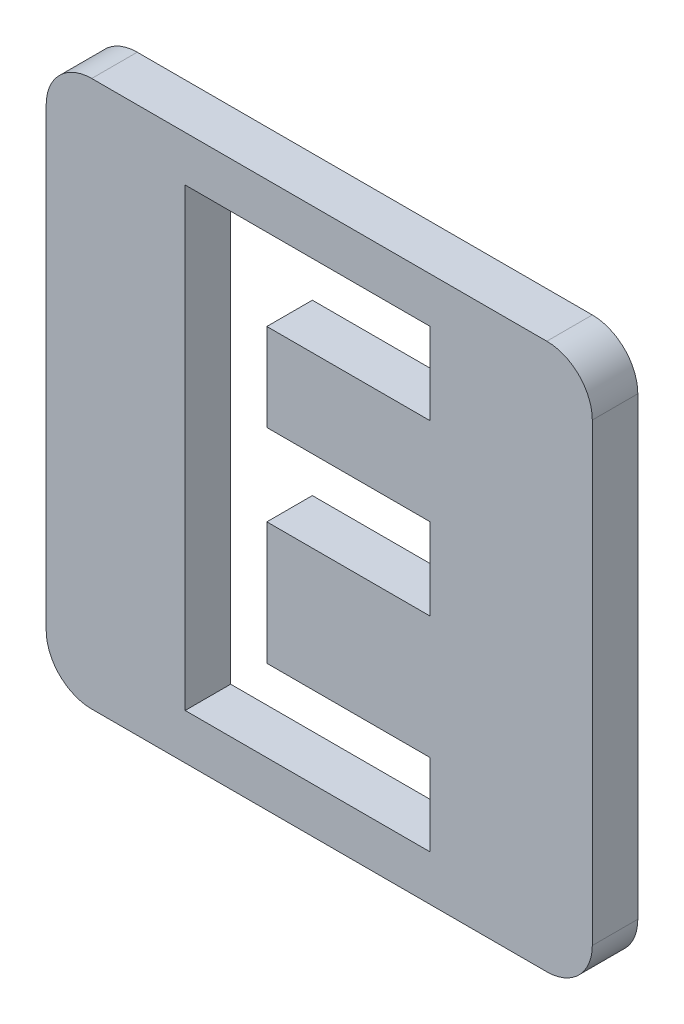
ISO-10303-21;
HEADER;
FILE_DESCRIPTION(('STEP AP214'),'2;1');
FILE_NAME('part.step','',(''),(''),'','','');
FILE_SCHEMA(('AUTOMOTIVE_DESIGN { 1 0 10303 214 1 1 1 1 }'));
ENDSEC;
DATA;
#1=APPLICATION_CONTEXT('core data for automotive mechanical design processes');
#2=APPLICATION_PROTOCOL_DEFINITION('international standard','automotive_design',2000,#1);
#3=PRODUCT_CONTEXT('',#1,'mechanical');
#4=PRODUCT('Part','Part','',(#3));
#5=PRODUCT_RELATED_PRODUCT_CATEGORY('part','',(#4));
#6=PRODUCT_DEFINITION_FORMATION('','',#4);
#7=PRODUCT_DEFINITION_CONTEXT('part definition',#1,'design');
#8=PRODUCT_DEFINITION('design','',#6,#7);
#9=PRODUCT_DEFINITION_SHAPE('','',#8);
#10=(LENGTH_UNIT() NAMED_UNIT(*) SI_UNIT(.MILLI.,.METRE.));
#11=(NAMED_UNIT(*) PLANE_ANGLE_UNIT() SI_UNIT($,.RADIAN.));
#12=(NAMED_UNIT(*) SI_UNIT($,.STERADIAN.) SOLID_ANGLE_UNIT());
#13=UNCERTAINTY_MEASURE_WITH_UNIT(LENGTH_MEASURE(1.E-05),#10,'distance_accuracy_value','');
#14=(GEOMETRIC_REPRESENTATION_CONTEXT(3) GLOBAL_UNCERTAINTY_ASSIGNED_CONTEXT((#13)) GLOBAL_UNIT_ASSIGNED_CONTEXT((#10,
#11,#12)) REPRESENTATION_CONTEXT('',''));
#15=CARTESIAN_POINT('',(0.,0.,0.));
#16=DIRECTION('',(0.,0.,1.));
#17=DIRECTION('',(1.,0.,0.));
#18=AXIS2_PLACEMENT_3D('',#15,#16,#17);
#19=CARTESIAN_POINT('',(50.,50.,10.));
#20=DIRECTION('',(0.,0.,-1.));
#21=DIRECTION('',(-1.,0.,0.));
#22=AXIS2_PLACEMENT_3D('',#19,#20,#21);
#23=PLANE('',#22);
#24=DIRECTION('',(1.,0.,0.));
#25=VECTOR('',#24,1.);
#26=CARTESIAN_POINT('',(-49.9999999999999,60.,10.));
#27=LINE('',#26,#25);
#28=CARTESIAN_POINT('',(-49.9999999999999,60.,10.));
#29=VERTEX_POINT('',#28);
#30=CARTESIAN_POINT('',(49.9999999999999,60.,10.));
#31=VERTEX_POINT('',#30);
#32=EDGE_CURVE('E265',#29,#31,#27,.T.);
#33=ORIENTED_EDGE('',*,*,#32,.F.);
#34=CARTESIAN_POINT('',(-50.,50.,10.));
#35=DIRECTION('',(0.,0.,1.));
#36=DIRECTION('',(1.,0.,0.));
#37=AXIS2_PLACEMENT_3D('',#34,#35,#36);
#38=CIRCLE('',#37,10.);
#39=CARTESIAN_POINT('',(-60.,49.9999999999999,10.));
#40=VERTEX_POINT('',#39);
#41=EDGE_CURVE('E283',#29,#40,#38,.T.);
#42=ORIENTED_EDGE('',*,*,#41,.T.);
#43=DIRECTION('',(0.,-1.,0.));
#44=VECTOR('',#43,1.);
#45=CARTESIAN_POINT('',(-60.,49.9999999999999,10.));
#46=LINE('',#45,#44);
#47=CARTESIAN_POINT('',(-60.,-49.9999999999999,10.));
#48=VERTEX_POINT('',#47);
#49=EDGE_CURVE('E281',#40,#48,#46,.T.);
#50=ORIENTED_EDGE('',*,*,#49,.T.);
#51=CARTESIAN_POINT('',(-50.,-50.,10.));
#52=DIRECTION('',(0.,0.,1.));
#53=DIRECTION('',(1.,0.,0.));
#54=AXIS2_PLACEMENT_3D('',#51,#52,#53);
#55=CIRCLE('',#54,10.);
#56=CARTESIAN_POINT('',(-49.9999999999999,-60.,10.));
#57=VERTEX_POINT('',#56);
#58=EDGE_CURVE('E279',#48,#57,#55,.T.);
#59=ORIENTED_EDGE('',*,*,#58,.T.);
#60=DIRECTION('',(1.,0.,0.));
#61=VECTOR('',#60,1.);
#62=CARTESIAN_POINT('',(-49.9999999999999,-60.,10.));
#63=LINE('',#62,#61);
#64=CARTESIAN_POINT('',(49.9999999999999,-60.,10.));
#65=VERTEX_POINT('',#64);
#66=EDGE_CURVE('E277',#57,#65,#63,.T.);
#67=ORIENTED_EDGE('',*,*,#66,.T.);
#68=CARTESIAN_POINT('',(50.,-50.,10.));
#69=DIRECTION('',(0.,0.,1.));
#70=DIRECTION('',(1.,0.,0.));
#71=AXIS2_PLACEMENT_3D('',#68,#69,#70);
#72=CIRCLE('',#71,10.);
#73=CARTESIAN_POINT('',(60.,-50.,10.));
#74=VERTEX_POINT('',#73);
#75=EDGE_CURVE('E275',#65,#74,#72,.T.);
#76=ORIENTED_EDGE('',*,*,#75,.T.);
#77=DIRECTION('',(0.,-1.,0.));
#78=VECTOR('',#77,1.);
#79=CARTESIAN_POINT('',(60.,49.9999999999999,10.));
#80=LINE('',#79,#78);
#81=CARTESIAN_POINT('',(60.,49.9999999999999,10.));
#82=VERTEX_POINT('',#81);
#83=EDGE_CURVE('E272',#82,#74,#80,.T.);
#84=ORIENTED_EDGE('',*,*,#83,.F.);
#85=CARTESIAN_POINT('',(50.,50.,10.));
#86=DIRECTION('',(0.,0.,-1.));
#87=DIRECTION('',(-1.,0.,0.));
#88=AXIS2_PLACEMENT_3D('',#85,#86,#87);
#89=CIRCLE('',#88,10.);
#90=EDGE_CURVE('E268',#31,#82,#89,.T.);
#91=ORIENTED_EDGE('',*,*,#90,.F.);
#92=EDGE_LOOP('',(#33,#42,#50,#59,#67,#76,#84,#91));
#93=FACE_BOUND('',#92,.T.);
#94=DIRECTION('',(0.,1.,0.));
#95=VECTOR('',#94,1.);
#96=CARTESIAN_POINT('',(-29.4615384615385,-50.,10.));
#97=LINE('',#96,#95);
#98=CARTESIAN_POINT('',(-29.4615384615385,-50.,10.));
#99=VERTEX_POINT('',#98);
#100=CARTESIAN_POINT('',(-29.4615384615385,50.,10.));
#101=VERTEX_POINT('',#100);
#102=EDGE_CURVE('E50',#99,#101,#97,.T.);
#103=ORIENTED_EDGE('',*,*,#102,.T.);
#104=DIRECTION('',(1.,0.,0.));
#105=VECTOR('',#104,1.);
#106=CARTESIAN_POINT('',(-29.4615384615385,50.,10.));
#107=LINE('',#106,#105);
#108=CARTESIAN_POINT('',(24.3846153846154,50.,10.));
#109=VERTEX_POINT('',#108);
#110=EDGE_CURVE('E186',#101,#109,#107,.T.);
#111=ORIENTED_EDGE('',*,*,#110,.T.);
#112=DIRECTION('',(0.,-1.,0.));
#113=VECTOR('',#112,1.);
#114=CARTESIAN_POINT('',(24.3846153846154,50.,10.));
#115=LINE('',#114,#113);
#116=CARTESIAN_POINT('',(24.3846153846154,32.0512820512821,10.));
#117=VERTEX_POINT('',#116);
#118=EDGE_CURVE('E217',#109,#117,#115,.T.);
#119=ORIENTED_EDGE('',*,*,#118,.T.);
#120=DIRECTION('',(-1.,0.,0.));
#121=VECTOR('',#120,1.);
#122=CARTESIAN_POINT('',(24.3846153846154,32.0512820512821,10.));
#123=LINE('',#122,#121);
#124=CARTESIAN_POINT('',(-11.5128205128205,32.0512820512821,10.));
#125=VERTEX_POINT('',#124);
#126=EDGE_CURVE('E220',#117,#125,#123,.T.);
#127=ORIENTED_EDGE('',*,*,#126,.T.);
#128=DIRECTION('',(0.,-1.,0.));
#129=VECTOR('',#128,1.);
#130=CARTESIAN_POINT('',(-11.5128205128205,32.0512820512821,10.));
#131=LINE('',#130,#129);
#132=CARTESIAN_POINT('',(-11.5128205128205,12.8205128205128,10.));
#133=VERTEX_POINT('',#132);
#134=EDGE_CURVE('E223',#125,#133,#131,.T.);
#135=ORIENTED_EDGE('',*,*,#134,.T.);
#136=DIRECTION('',(1.,0.,0.));
#137=VECTOR('',#136,1.);
#138=CARTESIAN_POINT('',(-11.5128205128205,12.8205128205128,10.));
#139=LINE('',#138,#137);
#140=CARTESIAN_POINT('',(24.3846153846154,12.8205128205128,10.));
#141=VERTEX_POINT('',#140);
#142=EDGE_CURVE('E226',#133,#141,#139,.T.);
#143=ORIENTED_EDGE('',*,*,#142,.T.);
#144=DIRECTION('',(0.,-1.,0.));
#145=VECTOR('',#144,1.);
#146=CARTESIAN_POINT('',(24.3846153846154,12.8205128205128,10.));
#147=LINE('',#146,#145);
#148=CARTESIAN_POINT('',(24.3846153846154,-5.12820512820513,10.));
#149=VERTEX_POINT('',#148);
#150=EDGE_CURVE('E229',#141,#149,#147,.T.);
#151=ORIENTED_EDGE('',*,*,#150,.T.);
#152=DIRECTION('',(-1.,0.,0.));
#153=VECTOR('',#152,1.);
#154=CARTESIAN_POINT('',(24.3846153846154,-5.12820512820513,10.));
#155=LINE('',#154,#153);
#156=CARTESIAN_POINT('',(-11.5128205128205,-5.12820512820513,10.));
#157=VERTEX_POINT('',#156);
#158=EDGE_CURVE('E232',#149,#157,#155,.T.);
#159=ORIENTED_EDGE('',*,*,#158,.T.);
#160=DIRECTION('',(0.,-1.,0.));
#161=VECTOR('',#160,1.);
#162=CARTESIAN_POINT('',(-11.5128205128205,-5.12820512820513,10.));
#163=LINE('',#162,#161);
#164=CARTESIAN_POINT('',(-11.5128205128205,-32.0512820512821,10.));
#165=VERTEX_POINT('',#164);
#166=EDGE_CURVE('E235',#157,#165,#163,.T.);
#167=ORIENTED_EDGE('',*,*,#166,.T.);
#168=DIRECTION('',(1.,0.,0.));
#169=VECTOR('',#168,1.);
#170=CARTESIAN_POINT('',(-11.5128205128205,-32.0512820512821,10.));
#171=LINE('',#170,#169);
#172=CARTESIAN_POINT('',(24.3846153846154,-32.0512820512821,10.));
#173=VERTEX_POINT('',#172);
#174=EDGE_CURVE('E238',#165,#173,#171,.T.);
#175=ORIENTED_EDGE('',*,*,#174,.T.);
#176=DIRECTION('',(0.,-1.,0.));
#177=VECTOR('',#176,1.);
#178=CARTESIAN_POINT('',(24.3846153846154,-32.0512820512821,10.));
#179=LINE('',#178,#177);
#180=CARTESIAN_POINT('',(24.3846153846154,-50.,10.));
#181=VERTEX_POINT('',#180);
#182=EDGE_CURVE('E241',#173,#181,#179,.T.);
#183=ORIENTED_EDGE('',*,*,#182,.T.);
#184=DIRECTION('',(-1.,0.,0.));
#185=VECTOR('',#184,1.);
#186=CARTESIAN_POINT('',(24.3846153846154,-50.,10.));
#187=LINE('',#186,#185);
#188=EDGE_CURVE('E180',#181,#99,#187,.T.);
#189=ORIENTED_EDGE('',*,*,#188,.T.);
#190=EDGE_LOOP('',(#103,#111,#119,#127,#135,#143,#151,#159,#167,#175,#183,#189));
#191=FACE_BOUND('',#190,.T.);
#192=ADVANCED_FACE('F33',(#93,#191),#23,.F.);
#193=CARTESIAN_POINT('',(50.,50.,0.));
#194=DIRECTION('',(0.,0.,-1.));
#195=DIRECTION('',(-1.,0.,0.));
#196=AXIS2_PLACEMENT_3D('',#193,#194,#195);
#197=PLANE('',#196);
#198=DIRECTION('',(1.,0.,0.));
#199=VECTOR('',#198,1.);
#200=CARTESIAN_POINT('',(-49.9999999999999,60.,0.));
#201=LINE('',#200,#199);
#202=CARTESIAN_POINT('',(-49.9999999999999,60.,0.));
#203=VERTEX_POINT('',#202);
#204=CARTESIAN_POINT('',(49.9999999999999,60.,0.));
#205=VERTEX_POINT('',#204);
#206=EDGE_CURVE('E187',#203,#205,#201,.T.);
#207=ORIENTED_EDGE('',*,*,#206,.T.);
#208=CARTESIAN_POINT('',(50.,50.,0.));
#209=DIRECTION('',(0.,0.,-1.));
#210=DIRECTION('',(-1.,0.,0.));
#211=AXIS2_PLACEMENT_3D('',#208,#209,#210);
#212=CIRCLE('',#211,10.);
#213=CARTESIAN_POINT('',(60.,49.9999999999999,0.));
#214=VERTEX_POINT('',#213);
#215=EDGE_CURVE('E287',#205,#214,#212,.T.);
#216=ORIENTED_EDGE('',*,*,#215,.T.);
#217=DIRECTION('',(0.,-1.,0.));
#218=VECTOR('',#217,1.);
#219=CARTESIAN_POINT('',(60.,49.9999999999999,0.));
#220=LINE('',#219,#218);
#221=CARTESIAN_POINT('',(60.,-50.,0.));
#222=VERTEX_POINT('',#221);
#223=EDGE_CURVE('E290',#214,#222,#220,.T.);
#224=ORIENTED_EDGE('',*,*,#223,.T.);
#225=CARTESIAN_POINT('',(50.,-50.,0.));
#226=DIRECTION('',(0.,0.,1.));
#227=DIRECTION('',(1.,0.,0.));
#228=AXIS2_PLACEMENT_3D('',#225,#226,#227);
#229=CIRCLE('',#228,10.);
#230=CARTESIAN_POINT('',(49.9999999999999,-60.,0.));
#231=VERTEX_POINT('',#230);
#232=EDGE_CURVE('E293',#231,#222,#229,.T.);
#233=ORIENTED_EDGE('',*,*,#232,.F.);
#234=DIRECTION('',(1.,0.,0.));
#235=VECTOR('',#234,1.);
#236=CARTESIAN_POINT('',(-49.9999999999999,-60.,0.));
#237=LINE('',#236,#235);
#238=CARTESIAN_POINT('',(-49.9999999999999,-60.,0.));
#239=VERTEX_POINT('',#238);
#240=EDGE_CURVE('E296',#239,#231,#237,.T.);
#241=ORIENTED_EDGE('',*,*,#240,.F.);
#242=CARTESIAN_POINT('',(-50.,-50.,0.));
#243=DIRECTION('',(0.,0.,1.));
#244=DIRECTION('',(1.,0.,0.));
#245=AXIS2_PLACEMENT_3D('',#242,#243,#244);
#246=CIRCLE('',#245,10.);
#247=CARTESIAN_POINT('',(-60.,-49.9999999999999,0.));
#248=VERTEX_POINT('',#247);
#249=EDGE_CURVE('E298',#248,#239,#246,.T.);
#250=ORIENTED_EDGE('',*,*,#249,.F.);
#251=DIRECTION('',(0.,-1.,0.));
#252=VECTOR('',#251,1.);
#253=CARTESIAN_POINT('',(-60.,49.9999999999999,0.));
#254=LINE('',#253,#252);
#255=CARTESIAN_POINT('',(-60.,49.9999999999999,0.));
#256=VERTEX_POINT('',#255);
#257=EDGE_CURVE('E300',#256,#248,#254,.T.);
#258=ORIENTED_EDGE('',*,*,#257,.F.);
#259=CARTESIAN_POINT('',(-50.,50.,0.));
#260=DIRECTION('',(0.,0.,1.));
#261=DIRECTION('',(1.,0.,0.));
#262=AXIS2_PLACEMENT_3D('',#259,#260,#261);
#263=CIRCLE('',#262,10.);
#264=EDGE_CURVE('E269',#203,#256,#263,.T.);
#265=ORIENTED_EDGE('',*,*,#264,.F.);
#266=EDGE_LOOP('',(#207,#216,#224,#233,#241,#250,#258,#265));
#267=FACE_BOUND('',#266,.T.);
#268=DIRECTION('',(1.,0.,0.));
#269=VECTOR('',#268,1.);
#270=CARTESIAN_POINT('',(-29.4615384615385,50.,0.));
#271=LINE('',#270,#269);
#272=CARTESIAN_POINT('',(-29.4615384615385,50.,0.));
#273=VERTEX_POINT('',#272);
#274=CARTESIAN_POINT('',(24.3846153846154,50.,0.));
#275=VERTEX_POINT('',#274);
#276=EDGE_CURVE('E179',#273,#275,#271,.T.);
#277=ORIENTED_EDGE('',*,*,#276,.F.);
#278=DIRECTION('',(0.,1.,0.));
#279=VECTOR('',#278,1.);
#280=CARTESIAN_POINT('',(-29.4615384615385,-50.,0.));
#281=LINE('',#280,#279);
#282=CARTESIAN_POINT('',(-29.4615384615385,-50.,0.));
#283=VERTEX_POINT('',#282);
#284=EDGE_CURVE('E171',#283,#273,#281,.T.);
#285=ORIENTED_EDGE('',*,*,#284,.F.);
#286=DIRECTION('',(-1.,0.,0.));
#287=VECTOR('',#286,1.);
#288=CARTESIAN_POINT('',(24.3846153846154,-50.,0.));
#289=LINE('',#288,#287);
#290=CARTESIAN_POINT('',(24.3846153846154,-50.,0.));
#291=VERTEX_POINT('',#290);
#292=EDGE_CURVE('E213',#291,#283,#289,.T.);
#293=ORIENTED_EDGE('',*,*,#292,.F.);
#294=DIRECTION('',(0.,-1.,0.));
#295=VECTOR('',#294,1.);
#296=CARTESIAN_POINT('',(24.3846153846154,-32.0512820512821,0.));
#297=LINE('',#296,#295);
#298=CARTESIAN_POINT('',(24.3846153846154,-32.0512820512821,0.));
#299=VERTEX_POINT('',#298);
#300=EDGE_CURVE('E211',#299,#291,#297,.T.);
#301=ORIENTED_EDGE('',*,*,#300,.F.);
#302=DIRECTION('',(1.,0.,0.));
#303=VECTOR('',#302,1.);
#304=CARTESIAN_POINT('',(-11.5128205128205,-32.0512820512821,0.));
#305=LINE('',#304,#303);
#306=CARTESIAN_POINT('',(-11.5128205128205,-32.0512820512821,0.));
#307=VERTEX_POINT('',#306);
#308=EDGE_CURVE('E209',#307,#299,#305,.T.);
#309=ORIENTED_EDGE('',*,*,#308,.F.);
#310=DIRECTION('',(0.,-1.,0.));
#311=VECTOR('',#310,1.);
#312=CARTESIAN_POINT('',(-11.5128205128205,-5.12820512820513,0.));
#313=LINE('',#312,#311);
#314=CARTESIAN_POINT('',(-11.5128205128205,-5.12820512820513,0.));
#315=VERTEX_POINT('',#314);
#316=EDGE_CURVE('E207',#315,#307,#313,.T.);
#317=ORIENTED_EDGE('',*,*,#316,.F.);
#318=DIRECTION('',(-1.,0.,0.));
#319=VECTOR('',#318,1.);
#320=CARTESIAN_POINT('',(24.3846153846154,-5.12820512820513,0.));
#321=LINE('',#320,#319);
#322=CARTESIAN_POINT('',(24.3846153846154,-5.12820512820513,0.));
#323=VERTEX_POINT('',#322);
#324=EDGE_CURVE('E205',#323,#315,#321,.T.);
#325=ORIENTED_EDGE('',*,*,#324,.F.);
#326=DIRECTION('',(0.,-1.,0.));
#327=VECTOR('',#326,1.);
#328=CARTESIAN_POINT('',(24.3846153846154,12.8205128205128,0.));
#329=LINE('',#328,#327);
#330=CARTESIAN_POINT('',(24.3846153846154,12.8205128205128,0.));
#331=VERTEX_POINT('',#330);
#332=EDGE_CURVE('E203',#331,#323,#329,.T.);
#333=ORIENTED_EDGE('',*,*,#332,.F.);
#334=DIRECTION('',(1.,0.,0.));
#335=VECTOR('',#334,1.);
#336=CARTESIAN_POINT('',(-11.5128205128205,12.8205128205128,0.));
#337=LINE('',#336,#335);
#338=CARTESIAN_POINT('',(-11.5128205128205,12.8205128205128,0.));
#339=VERTEX_POINT('',#338);
#340=EDGE_CURVE('E201',#339,#331,#337,.T.);
#341=ORIENTED_EDGE('',*,*,#340,.F.);
#342=DIRECTION('',(0.,-1.,0.));
#343=VECTOR('',#342,1.);
#344=CARTESIAN_POINT('',(-11.5128205128205,32.0512820512821,0.));
#345=LINE('',#344,#343);
#346=CARTESIAN_POINT('',(-11.5128205128205,32.0512820512821,0.));
#347=VERTEX_POINT('',#346);
#348=EDGE_CURVE('E199',#347,#339,#345,.T.);
#349=ORIENTED_EDGE('',*,*,#348,.F.);
#350=DIRECTION('',(-1.,0.,0.));
#351=VECTOR('',#350,1.);
#352=CARTESIAN_POINT('',(24.3846153846154,32.0512820512821,0.));
#353=LINE('',#352,#351);
#354=CARTESIAN_POINT('',(24.3846153846154,32.0512820512821,0.));
#355=VERTEX_POINT('',#354);
#356=EDGE_CURVE('E195',#355,#347,#353,.T.);
#357=ORIENTED_EDGE('',*,*,#356,.F.);
#358=DIRECTION('',(0.,-1.,0.));
#359=VECTOR('',#358,1.);
#360=CARTESIAN_POINT('',(24.3846153846154,50.,0.));
#361=LINE('',#360,#359);
#362=EDGE_CURVE('E193',#275,#355,#361,.T.);
#363=ORIENTED_EDGE('',*,*,#362,.F.);
#364=EDGE_LOOP('',(#277,#285,#293,#301,#309,#317,#325,#333,#341,#349,#357,#363));
#365=FACE_BOUND('',#364,.T.);
#366=ADVANCED_FACE('F191',(#267,#365),#197,.T.);
#367=CARTESIAN_POINT('',(-49.9999999999999,60.,10.));
#368=DIRECTION('',(0.,1.,0.));
#369=DIRECTION('',(0.,0.,1.));
#370=AXIS2_PLACEMENT_3D('',#367,#368,#369);
#371=PLANE('',#370);
#372=ORIENTED_EDGE('',*,*,#206,.F.);
#373=DIRECTION('',(0.,0.,-1.));
#374=VECTOR('',#373,1.);
#375=CARTESIAN_POINT('',(-49.9999999999999,60.,10.));
#376=LINE('',#375,#374);
#377=EDGE_CURVE('E11',#29,#203,#376,.T.);
#378=ORIENTED_EDGE('',*,*,#377,.F.);
#379=ORIENTED_EDGE('',*,*,#32,.T.);
#380=DIRECTION('',(0.,0.,-1.));
#381=VECTOR('',#380,1.);
#382=CARTESIAN_POINT('',(49.9999999999999,60.,10.));
#383=LINE('',#382,#381);
#384=EDGE_CURVE('E37',#31,#205,#383,.T.);
#385=ORIENTED_EDGE('',*,*,#384,.T.);
#386=EDGE_LOOP('',(#372,#378,#379,#385));
#387=FACE_BOUND('',#386,.T.);
#388=ADVANCED_FACE('F35',(#387),#371,.T.);
#389=CARTESIAN_POINT('',(-50.,50.,10.));
#390=DIRECTION('',(0.,0.,-1.));
#391=DIRECTION('',(-1.,0.,0.));
#392=AXIS2_PLACEMENT_3D('',#389,#390,#391);
#393=CYLINDRICAL_SURFACE('',#392,10.);
#394=ORIENTED_EDGE('',*,*,#264,.T.);
#395=DIRECTION('',(0.,0.,-1.));
#396=VECTOR('',#395,1.);
#397=CARTESIAN_POINT('',(-60.,49.9999999999999,10.));
#398=LINE('',#397,#396);
#399=EDGE_CURVE('E42',#40,#256,#398,.T.);
#400=ORIENTED_EDGE('',*,*,#399,.F.);
#401=ORIENTED_EDGE('',*,*,#41,.F.);
#402=ORIENTED_EDGE('',*,*,#377,.T.);
#403=EDGE_LOOP('',(#394,#400,#401,#402));
#404=FACE_BOUND('',#403,.T.);
#405=ADVANCED_FACE('F330',(#404),#393,.T.);
#406=CARTESIAN_POINT('',(-60.,49.9999999999999,10.));
#407=DIRECTION('',(1.,0.,0.));
#408=DIRECTION('',(0.,1.,0.));
#409=AXIS2_PLACEMENT_3D('',#406,#407,#408);
#410=PLANE('',#409);
#411=ORIENTED_EDGE('',*,*,#257,.T.);
#412=DIRECTION('',(0.,0.,-1.));
#413=VECTOR('',#412,1.);
#414=CARTESIAN_POINT('',(-60.,-49.9999999999999,10.));
#415=LINE('',#414,#413);
#416=EDGE_CURVE('E305',#48,#248,#415,.T.);
#417=ORIENTED_EDGE('',*,*,#416,.F.);
#418=ORIENTED_EDGE('',*,*,#49,.F.);
#419=ORIENTED_EDGE('',*,*,#399,.T.);
#420=EDGE_LOOP('',(#411,#417,#418,#419));
#421=FACE_BOUND('',#420,.T.);
#422=ADVANCED_FACE('F334',(#421),#410,.F.);
#423=CARTESIAN_POINT('',(-50.,-50.,10.));
#424=DIRECTION('',(0.,0.,-1.));
#425=DIRECTION('',(-1.,0.,0.));
#426=AXIS2_PLACEMENT_3D('',#423,#424,#425);
#427=CYLINDRICAL_SURFACE('',#426,10.);
#428=ORIENTED_EDGE('',*,*,#249,.T.);
#429=DIRECTION('',(0.,0.,-1.));
#430=VECTOR('',#429,1.);
#431=CARTESIAN_POINT('',(-49.9999999999999,-60.,10.));
#432=LINE('',#431,#430);
#433=EDGE_CURVE('E308',#57,#239,#432,.T.);
#434=ORIENTED_EDGE('',*,*,#433,.F.);
#435=ORIENTED_EDGE('',*,*,#58,.F.);
#436=ORIENTED_EDGE('',*,*,#416,.T.);
#437=EDGE_LOOP('',(#428,#434,#435,#436));
#438=FACE_BOUND('',#437,.T.);
#439=ADVANCED_FACE('F354',(#438),#427,.T.);
#440=CARTESIAN_POINT('',(-49.9999999999999,-60.,10.));
#441=DIRECTION('',(0.,1.,0.));
#442=DIRECTION('',(0.,0.,1.));
#443=AXIS2_PLACEMENT_3D('',#440,#441,#442);
#444=PLANE('',#443);
#445=ORIENTED_EDGE('',*,*,#240,.T.);
#446=DIRECTION('',(0.,0.,-1.));
#447=VECTOR('',#446,1.);
#448=CARTESIAN_POINT('',(49.9999999999999,-60.,10.));
#449=LINE('',#448,#447);
#450=EDGE_CURVE('E311',#65,#231,#449,.T.);
#451=ORIENTED_EDGE('',*,*,#450,.F.);
#452=ORIENTED_EDGE('',*,*,#66,.F.);
#453=ORIENTED_EDGE('',*,*,#433,.T.);
#454=EDGE_LOOP('',(#445,#451,#452,#453));
#455=FACE_BOUND('',#454,.T.);
#456=ADVANCED_FACE('F352',(#455),#444,.F.);
#457=CARTESIAN_POINT('',(50.,-50.,10.));
#458=DIRECTION('',(0.,0.,-1.));
#459=DIRECTION('',(-1.,0.,0.));
#460=AXIS2_PLACEMENT_3D('',#457,#458,#459);
#461=CYLINDRICAL_SURFACE('',#460,10.);
#462=ORIENTED_EDGE('',*,*,#232,.T.);
#463=DIRECTION('',(0.,0.,-1.));
#464=VECTOR('',#463,1.);
#465=CARTESIAN_POINT('',(60.,-50.,10.));
#466=LINE('',#465,#464);
#467=EDGE_CURVE('E314',#74,#222,#466,.T.);
#468=ORIENTED_EDGE('',*,*,#467,.F.);
#469=ORIENTED_EDGE('',*,*,#75,.F.);
#470=ORIENTED_EDGE('',*,*,#450,.T.);
#471=EDGE_LOOP('',(#462,#468,#469,#470));
#472=FACE_BOUND('',#471,.T.);
#473=ADVANCED_FACE('F348',(#472),#461,.T.);
#474=CARTESIAN_POINT('',(60.,49.9999999999999,10.));
#475=DIRECTION('',(1.,0.,0.));
#476=DIRECTION('',(0.,1.,0.));
#477=AXIS2_PLACEMENT_3D('',#474,#475,#476);
#478=PLANE('',#477);
#479=ORIENTED_EDGE('',*,*,#223,.F.);
#480=DIRECTION('',(0.,0.,-1.));
#481=VECTOR('',#480,1.);
#482=CARTESIAN_POINT('',(60.,49.9999999999999,10.));
#483=LINE('',#482,#481);
#484=EDGE_CURVE('E315',#82,#214,#483,.T.);
#485=ORIENTED_EDGE('',*,*,#484,.F.);
#486=ORIENTED_EDGE('',*,*,#83,.T.);
#487=ORIENTED_EDGE('',*,*,#467,.T.);
#488=EDGE_LOOP('',(#479,#485,#486,#487));
#489=FACE_BOUND('',#488,.T.);
#490=ADVANCED_FACE('F344',(#489),#478,.T.);
#491=CARTESIAN_POINT('',(50.,50.,10.));
#492=DIRECTION('',(0.,0.,-1.));
#493=DIRECTION('',(-1.,0.,0.));
#494=AXIS2_PLACEMENT_3D('',#491,#492,#493);
#495=CYLINDRICAL_SURFACE('',#494,10.);
#496=ORIENTED_EDGE('',*,*,#215,.F.);
#497=ORIENTED_EDGE('',*,*,#384,.F.);
#498=ORIENTED_EDGE('',*,*,#90,.T.);
#499=ORIENTED_EDGE('',*,*,#484,.T.);
#500=EDGE_LOOP('',(#496,#497,#498,#499));
#501=FACE_BOUND('',#500,.T.);
#502=ADVANCED_FACE('F323',(#501),#495,.T.);
#503=CARTESIAN_POINT('',(-29.4615384615385,-50.,0.));
#504=DIRECTION('',(1.,0.,0.));
#505=DIRECTION('',(0.,0.,-1.));
#506=AXIS2_PLACEMENT_3D('',#503,#504,#505);
#507=PLANE('',#506);
#508=ORIENTED_EDGE('',*,*,#102,.F.);
#509=DIRECTION('',(0.,0.,1.));
#510=VECTOR('',#509,1.);
#511=CARTESIAN_POINT('',(-29.4615384615385,-50.,0.));
#512=LINE('',#511,#510);
#513=EDGE_CURVE('E175',#283,#99,#512,.T.);
#514=ORIENTED_EDGE('',*,*,#513,.F.);
#515=ORIENTED_EDGE('',*,*,#284,.T.);
#516=DIRECTION('',(0.,0.,1.));
#517=VECTOR('',#516,1.);
#518=CARTESIAN_POINT('',(-29.4615384615385,50.,0.));
#519=LINE('',#518,#517);
#520=EDGE_CURVE('E174',#273,#101,#519,.T.);
#521=ORIENTED_EDGE('',*,*,#520,.T.);
#522=EDGE_LOOP('',(#508,#514,#515,#521));
#523=FACE_BOUND('',#522,.T.);
#524=ADVANCED_FACE('F173',(#523),#507,.T.);
#525=CARTESIAN_POINT('',(-29.4615384615385,50.,0.));
#526=DIRECTION('',(0.,-1.,0.));
#527=DIRECTION('',(0.,0.,-1.));
#528=AXIS2_PLACEMENT_3D('',#525,#526,#527);
#529=PLANE('',#528);
#530=ORIENTED_EDGE('',*,*,#110,.F.);
#531=ORIENTED_EDGE('',*,*,#520,.F.);
#532=ORIENTED_EDGE('',*,*,#276,.T.);
#533=DIRECTION('',(0.,0.,1.));
#534=VECTOR('',#533,1.);
#535=CARTESIAN_POINT('',(24.3846153846154,50.,0.));
#536=LINE('',#535,#534);
#537=EDGE_CURVE('E188',#275,#109,#536,.T.);
#538=ORIENTED_EDGE('',*,*,#537,.T.);
#539=EDGE_LOOP('',(#530,#531,#532,#538));
#540=FACE_BOUND('',#539,.T.);
#541=ADVANCED_FACE('F183',(#540),#529,.T.);
#542=CARTESIAN_POINT('',(24.3846153846154,50.,0.));
#543=DIRECTION('',(-1.,0.,0.));
#544=DIRECTION('',(0.,0.,1.));
#545=AXIS2_PLACEMENT_3D('',#542,#543,#544);
#546=PLANE('',#545);
#547=ORIENTED_EDGE('',*,*,#118,.F.);
#548=ORIENTED_EDGE('',*,*,#537,.F.);
#549=ORIENTED_EDGE('',*,*,#362,.T.);
#550=DIRECTION('',(0.,0.,1.));
#551=VECTOR('',#550,1.);
#552=CARTESIAN_POINT('',(24.3846153846154,32.0512820512821,0.));
#553=LINE('',#552,#551);
#554=EDGE_CURVE('E262',#355,#117,#553,.T.);
#555=ORIENTED_EDGE('',*,*,#554,.T.);
#556=EDGE_LOOP('',(#547,#548,#549,#555));
#557=FACE_BOUND('',#556,.T.);
#558=ADVANCED_FACE('F403',(#557),#546,.T.);
#559=CARTESIAN_POINT('',(24.3846153846154,32.0512820512821,0.));
#560=DIRECTION('',(0.,1.,0.));
#561=DIRECTION('',(0.,0.,1.));
#562=AXIS2_PLACEMENT_3D('',#559,#560,#561);
#563=PLANE('',#562);
#564=ORIENTED_EDGE('',*,*,#126,.F.);
#565=ORIENTED_EDGE('',*,*,#554,.F.);
#566=ORIENTED_EDGE('',*,*,#356,.T.);
#567=DIRECTION('',(0.,0.,1.));
#568=VECTOR('',#567,1.);
#569=CARTESIAN_POINT('',(-11.5128205128205,32.0512820512821,0.));
#570=LINE('',#569,#568);
#571=EDGE_CURVE('E260',#347,#125,#570,.T.);
#572=ORIENTED_EDGE('',*,*,#571,.T.);
#573=EDGE_LOOP('',(#564,#565,#566,#572));
#574=FACE_BOUND('',#573,.T.);
#575=ADVANCED_FACE('F411',(#574),#563,.T.);
#576=CARTESIAN_POINT('',(-11.5128205128205,32.0512820512821,0.));
#577=DIRECTION('',(-1.,0.,0.));
#578=DIRECTION('',(0.,0.,1.));
#579=AXIS2_PLACEMENT_3D('',#576,#577,#578);
#580=PLANE('',#579);
#581=ORIENTED_EDGE('',*,*,#134,.F.);
#582=ORIENTED_EDGE('',*,*,#571,.F.);
#583=ORIENTED_EDGE('',*,*,#348,.T.);
#584=DIRECTION('',(0.,0.,1.));
#585=VECTOR('',#584,1.);
#586=CARTESIAN_POINT('',(-11.5128205128205,12.8205128205128,0.));
#587=LINE('',#586,#585);
#588=EDGE_CURVE('E258',#339,#133,#587,.T.);
#589=ORIENTED_EDGE('',*,*,#588,.T.);
#590=EDGE_LOOP('',(#581,#582,#583,#589));
#591=FACE_BOUND('',#590,.T.);
#592=ADVANCED_FACE('F421',(#591),#580,.T.);
#593=CARTESIAN_POINT('',(-11.5128205128205,12.8205128205128,0.));
#594=DIRECTION('',(0.,-1.,0.));
#595=DIRECTION('',(0.,0.,-1.));
#596=AXIS2_PLACEMENT_3D('',#593,#594,#595);
#597=PLANE('',#596);
#598=ORIENTED_EDGE('',*,*,#142,.F.);
#599=ORIENTED_EDGE('',*,*,#588,.F.);
#600=ORIENTED_EDGE('',*,*,#340,.T.);
#601=DIRECTION('',(0.,0.,1.));
#602=VECTOR('',#601,1.);
#603=CARTESIAN_POINT('',(24.3846153846154,12.8205128205128,0.));
#604=LINE('',#603,#602);
#605=EDGE_CURVE('E256',#331,#141,#604,.T.);
#606=ORIENTED_EDGE('',*,*,#605,.T.);
#607=EDGE_LOOP('',(#598,#599,#600,#606));
#608=FACE_BOUND('',#607,.T.);
#609=ADVANCED_FACE('F431',(#608),#597,.T.);
#610=CARTESIAN_POINT('',(24.3846153846154,12.8205128205128,0.));
#611=DIRECTION('',(-1.,0.,0.));
#612=DIRECTION('',(0.,0.,1.));
#613=AXIS2_PLACEMENT_3D('',#610,#611,#612);
#614=PLANE('',#613);
#615=ORIENTED_EDGE('',*,*,#150,.F.);
#616=ORIENTED_EDGE('',*,*,#605,.F.);
#617=ORIENTED_EDGE('',*,*,#332,.T.);
#618=DIRECTION('',(0.,0.,1.));
#619=VECTOR('',#618,1.);
#620=CARTESIAN_POINT('',(24.3846153846154,-5.12820512820513,0.));
#621=LINE('',#620,#619);
#622=EDGE_CURVE('E254',#323,#149,#621,.T.);
#623=ORIENTED_EDGE('',*,*,#622,.T.);
#624=EDGE_LOOP('',(#615,#616,#617,#623));
#625=FACE_BOUND('',#624,.T.);
#626=ADVANCED_FACE('F441',(#625),#614,.T.);
#627=CARTESIAN_POINT('',(24.3846153846154,-5.12820512820513,0.));
#628=DIRECTION('',(0.,1.,0.));
#629=DIRECTION('',(0.,0.,1.));
#630=AXIS2_PLACEMENT_3D('',#627,#628,#629);
#631=PLANE('',#630);
#632=ORIENTED_EDGE('',*,*,#158,.F.);
#633=ORIENTED_EDGE('',*,*,#622,.F.);
#634=ORIENTED_EDGE('',*,*,#324,.T.);
#635=DIRECTION('',(0.,0.,1.));
#636=VECTOR('',#635,1.);
#637=CARTESIAN_POINT('',(-11.5128205128205,-5.12820512820513,0.));
#638=LINE('',#637,#636);
#639=EDGE_CURVE('E252',#315,#157,#638,.T.);
#640=ORIENTED_EDGE('',*,*,#639,.T.);
#641=EDGE_LOOP('',(#632,#633,#634,#640));
#642=FACE_BOUND('',#641,.T.);
#643=ADVANCED_FACE('F451',(#642),#631,.T.);
#644=CARTESIAN_POINT('',(-11.5128205128205,-5.12820512820513,0.));
#645=DIRECTION('',(-1.,0.,0.));
#646=DIRECTION('',(0.,0.,1.));
#647=AXIS2_PLACEMENT_3D('',#644,#645,#646);
#648=PLANE('',#647);
#649=ORIENTED_EDGE('',*,*,#166,.F.);
#650=ORIENTED_EDGE('',*,*,#639,.F.);
#651=ORIENTED_EDGE('',*,*,#316,.T.);
#652=DIRECTION('',(0.,0.,1.));
#653=VECTOR('',#652,1.);
#654=CARTESIAN_POINT('',(-11.5128205128205,-32.0512820512821,0.));
#655=LINE('',#654,#653);
#656=EDGE_CURVE('E250',#307,#165,#655,.T.);
#657=ORIENTED_EDGE('',*,*,#656,.T.);
#658=EDGE_LOOP('',(#649,#650,#651,#657));
#659=FACE_BOUND('',#658,.T.);
#660=ADVANCED_FACE('F461',(#659),#648,.T.);
#661=CARTESIAN_POINT('',(-11.5128205128205,-32.0512820512821,0.));
#662=DIRECTION('',(0.,-1.,0.));
#663=DIRECTION('',(0.,0.,-1.));
#664=AXIS2_PLACEMENT_3D('',#661,#662,#663);
#665=PLANE('',#664);
#666=ORIENTED_EDGE('',*,*,#174,.F.);
#667=ORIENTED_EDGE('',*,*,#656,.F.);
#668=ORIENTED_EDGE('',*,*,#308,.T.);
#669=DIRECTION('',(0.,0.,1.));
#670=VECTOR('',#669,1.);
#671=CARTESIAN_POINT('',(24.3846153846154,-32.0512820512821,0.));
#672=LINE('',#671,#670);
#673=EDGE_CURVE('E248',#299,#173,#672,.T.);
#674=ORIENTED_EDGE('',*,*,#673,.T.);
#675=EDGE_LOOP('',(#666,#667,#668,#674));
#676=FACE_BOUND('',#675,.T.);
#677=ADVANCED_FACE('F471',(#676),#665,.T.);
#678=CARTESIAN_POINT('',(24.3846153846154,-32.0512820512821,0.));
#679=DIRECTION('',(-1.,0.,0.));
#680=DIRECTION('',(0.,0.,1.));
#681=AXIS2_PLACEMENT_3D('',#678,#679,#680);
#682=PLANE('',#681);
#683=ORIENTED_EDGE('',*,*,#182,.F.);
#684=ORIENTED_EDGE('',*,*,#673,.F.);
#685=ORIENTED_EDGE('',*,*,#300,.T.);
#686=DIRECTION('',(0.,0.,1.));
#687=VECTOR('',#686,1.);
#688=CARTESIAN_POINT('',(24.3846153846154,-50.,0.));
#689=LINE('',#688,#687);
#690=EDGE_CURVE('E58',#291,#181,#689,.T.);
#691=ORIENTED_EDGE('',*,*,#690,.T.);
#692=EDGE_LOOP('',(#683,#684,#685,#691));
#693=FACE_BOUND('',#692,.T.);
#694=ADVANCED_FACE('F481',(#693),#682,.T.);
#695=CARTESIAN_POINT('',(24.3846153846154,-50.,0.));
#696=DIRECTION('',(0.,1.,0.));
#697=DIRECTION('',(0.,0.,1.));
#698=AXIS2_PLACEMENT_3D('',#695,#696,#697);
#699=PLANE('',#698);
#700=ORIENTED_EDGE('',*,*,#188,.F.);
#701=ORIENTED_EDGE('',*,*,#690,.F.);
#702=ORIENTED_EDGE('',*,*,#292,.T.);
#703=ORIENTED_EDGE('',*,*,#513,.T.);
#704=EDGE_LOOP('',(#700,#701,#702,#703));
#705=FACE_BOUND('',#704,.T.);
#706=ADVANCED_FACE('F491',(#705),#699,.T.);
#707=CLOSED_SHELL('',(#192,#366,#388,#405,#422,#439,#456,#473,#490,#502,#524,#541,#558,#575,
#592,#609,#626,#643,#660,#677,#694,#706));
#708=MANIFOLD_SOLID_BREP('B2',#707);
#709=ADVANCED_BREP_SHAPE_REPRESENTATION('',(#18,#708),#14);
#710=SHAPE_DEFINITION_REPRESENTATION(#9,#709);
ENDSEC;
END-ISO-10303-21;
